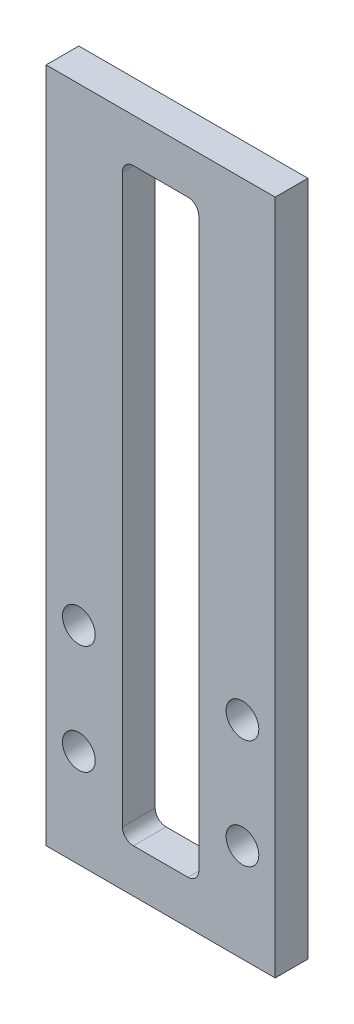
ISO-10303-21;
HEADER;
FILE_DESCRIPTION(('STEP AP214'),'2;1');
FILE_NAME('part.step','',(''),(''),'','','');
FILE_SCHEMA(('AUTOMOTIVE_DESIGN { 1 0 10303 214 1 1 1 1 }'));
ENDSEC;
DATA;
#1=APPLICATION_CONTEXT('core data for automotive mechanical design processes');
#2=APPLICATION_PROTOCOL_DEFINITION('international standard','automotive_design',2000,#1);
#3=PRODUCT_CONTEXT('',#1,'mechanical');
#4=PRODUCT('Part','Part','',(#3));
#5=PRODUCT_RELATED_PRODUCT_CATEGORY('part','',(#4));
#6=PRODUCT_DEFINITION_FORMATION('','',#4);
#7=PRODUCT_DEFINITION_CONTEXT('part definition',#1,'design');
#8=PRODUCT_DEFINITION('design','',#6,#7);
#9=PRODUCT_DEFINITION_SHAPE('','',#8);
#10=(LENGTH_UNIT() NAMED_UNIT(*) SI_UNIT(.MILLI.,.METRE.));
#11=(NAMED_UNIT(*) PLANE_ANGLE_UNIT() SI_UNIT($,.RADIAN.));
#12=(NAMED_UNIT(*) SI_UNIT($,.STERADIAN.) SOLID_ANGLE_UNIT());
#13=UNCERTAINTY_MEASURE_WITH_UNIT(LENGTH_MEASURE(1.E-05),#10,'distance_accuracy_value','');
#14=(GEOMETRIC_REPRESENTATION_CONTEXT(3) GLOBAL_UNCERTAINTY_ASSIGNED_CONTEXT((#13)) GLOBAL_UNIT_ASSIGNED_CONTEXT((#10,
#11,#12)) REPRESENTATION_CONTEXT('',''));
#15=CARTESIAN_POINT('',(0.,0.,0.));
#16=DIRECTION('',(0.,0.,1.));
#17=DIRECTION('',(1.,0.,0.));
#18=AXIS2_PLACEMENT_3D('',#15,#16,#17);
#19=CARTESIAN_POINT('',(0.,0.,3.));
#20=DIRECTION('',(0.,0.,1.));
#21=DIRECTION('',(1.,0.,0.));
#22=AXIS2_PLACEMENT_3D('',#19,#20,#21);
#23=PLANE('',#22);
#24=DIRECTION('',(0.,-1.,0.));
#25=VECTOR('',#24,1.);
#26=CARTESIAN_POINT('',(-3.49999999999999,44.,3.));
#27=LINE('',#26,#25);
#28=CARTESIAN_POINT('',(-3.49999999999999,43.,3.));
#29=VERTEX_POINT('',#28);
#30=CARTESIAN_POINT('',(-3.5,-8.99999999999999,3.));
#31=VERTEX_POINT('',#30);
#32=EDGE_CURVE('E229',#29,#31,#27,.T.);
#33=ORIENTED_EDGE('',*,*,#32,.F.);
#34=CARTESIAN_POINT('',(-2.49999999999999,43.,3.));
#35=DIRECTION('',(0.,0.,1.));
#36=DIRECTION('',(1.,0.,0.));
#37=AXIS2_PLACEMENT_3D('',#34,#35,#36);
#38=CIRCLE('',#37,1.);
#39=CARTESIAN_POINT('',(-2.49999999999999,44.,3.));
#40=VERTEX_POINT('',#39);
#41=EDGE_CURVE('E42',#29,#40,#38,.F.);
#42=ORIENTED_EDGE('',*,*,#41,.T.);
#43=DIRECTION('',(-1.,0.,0.));
#44=VECTOR('',#43,1.);
#45=CARTESIAN_POINT('',(-3.49999999999999,44.,3.));
#46=LINE('',#45,#44);
#47=CARTESIAN_POINT('',(2.49999999999999,44.,3.));
#48=VERTEX_POINT('',#47);
#49=EDGE_CURVE('E227',#48,#40,#46,.T.);
#50=ORIENTED_EDGE('',*,*,#49,.F.);
#51=CARTESIAN_POINT('',(2.49999999999999,43.,3.));
#52=DIRECTION('',(0.,0.,1.));
#53=DIRECTION('',(1.,0.,0.));
#54=AXIS2_PLACEMENT_3D('',#51,#52,#53);
#55=CIRCLE('',#54,1.);
#56=CARTESIAN_POINT('',(3.49999999999999,43.,3.));
#57=VERTEX_POINT('',#56);
#58=EDGE_CURVE('E222',#48,#57,#55,.F.);
#59=ORIENTED_EDGE('',*,*,#58,.T.);
#60=DIRECTION('',(0.,1.,0.));
#61=VECTOR('',#60,1.);
#62=CARTESIAN_POINT('',(3.49999999999999,44.,3.));
#63=LINE('',#62,#61);
#64=CARTESIAN_POINT('',(3.5,-8.99999999999999,3.));
#65=VERTEX_POINT('',#64);
#66=EDGE_CURVE('E235',#65,#57,#63,.T.);
#67=ORIENTED_EDGE('',*,*,#66,.F.);
#68=CARTESIAN_POINT('',(2.5,-8.99999999999999,3.));
#69=DIRECTION('',(0.,0.,1.));
#70=DIRECTION('',(1.,0.,0.));
#71=AXIS2_PLACEMENT_3D('',#68,#69,#70);
#72=CIRCLE('',#71,1.);
#73=CARTESIAN_POINT('',(2.5,-10.,3.));
#74=VERTEX_POINT('',#73);
#75=EDGE_CURVE('E214',#65,#74,#72,.F.);
#76=ORIENTED_EDGE('',*,*,#75,.T.);
#77=DIRECTION('',(1.,0.,0.));
#78=VECTOR('',#77,1.);
#79=CARTESIAN_POINT('',(-3.5,-10.,3.));
#80=LINE('',#79,#78);
#81=CARTESIAN_POINT('',(-2.5,-10.,3.));
#82=VERTEX_POINT('',#81);
#83=EDGE_CURVE('E252',#82,#74,#80,.T.);
#84=ORIENTED_EDGE('',*,*,#83,.F.);
#85=CARTESIAN_POINT('',(-2.5,-9.,3.));
#86=DIRECTION('',(0.,0.,1.));
#87=DIRECTION('',(1.,0.,0.));
#88=AXIS2_PLACEMENT_3D('',#85,#86,#87);
#89=CIRCLE('',#88,1.);
#90=EDGE_CURVE('E218',#82,#31,#89,.F.);
#91=ORIENTED_EDGE('',*,*,#90,.T.);
#92=EDGE_LOOP('',(#33,#42,#50,#59,#67,#76,#84,#91));
#93=FACE_BOUND('',#92,.T.);
#94=DIRECTION('',(0.,1.,0.));
#95=VECTOR('',#94,1.);
#96=CARTESIAN_POINT('',(10.5,-14.,3.));
#97=LINE('',#96,#95);
#98=CARTESIAN_POINT('',(10.5,-14.,3.));
#99=VERTEX_POINT('',#98);
#100=CARTESIAN_POINT('',(10.5,48.,3.));
#101=VERTEX_POINT('',#100);
#102=EDGE_CURVE('E124',#99,#101,#97,.T.);
#103=ORIENTED_EDGE('',*,*,#102,.T.);
#104=DIRECTION('',(-1.,0.,0.));
#105=VECTOR('',#104,1.);
#106=CARTESIAN_POINT('',(-10.5,48.,3.));
#107=LINE('',#106,#105);
#108=CARTESIAN_POINT('',(-10.5,48.,3.));
#109=VERTEX_POINT('',#108);
#110=EDGE_CURVE('E129',#101,#109,#107,.T.);
#111=ORIENTED_EDGE('',*,*,#110,.T.);
#112=DIRECTION('',(0.,-1.,0.));
#113=VECTOR('',#112,1.);
#114=CARTESIAN_POINT('',(-10.5,14.,3.));
#115=LINE('',#114,#113);
#116=CARTESIAN_POINT('',(-10.5,-14.,3.));
#117=VERTEX_POINT('',#116);
#118=EDGE_CURVE('E183',#109,#117,#115,.T.);
#119=ORIENTED_EDGE('',*,*,#118,.T.);
#120=DIRECTION('',(1.,0.,0.));
#121=VECTOR('',#120,1.);
#122=CARTESIAN_POINT('',(-10.5,-14.,3.));
#123=LINE('',#122,#121);
#124=EDGE_CURVE('E130',#117,#99,#123,.T.);
#125=ORIENTED_EDGE('',*,*,#124,.T.);
#126=EDGE_LOOP('',(#103,#111,#119,#125));
#127=FACE_BOUND('',#126,.T.);
#128=CARTESIAN_POINT('',(-7.5,-5.,3.));
#129=DIRECTION('',(0.,0.,1.));
#130=DIRECTION('',(1.,0.,0.));
#131=AXIS2_PLACEMENT_3D('',#128,#129,#130);
#132=CIRCLE('',#131,1.5);
#133=CARTESIAN_POINT('',(-6.,-5.,3.));
#134=VERTEX_POINT('',#133);
#135=EDGE_CURVE('E165',#134,#134,#132,.T.);
#136=ORIENTED_EDGE('',*,*,#135,.F.);
#137=EDGE_LOOP('',(#136));
#138=FACE_BOUND('',#137,.T.);
#139=CARTESIAN_POINT('',(-7.5,5.,3.));
#140=DIRECTION('',(0.,0.,1.));
#141=DIRECTION('',(1.,0.,0.));
#142=AXIS2_PLACEMENT_3D('',#139,#140,#141);
#143=CIRCLE('',#142,1.5);
#144=CARTESIAN_POINT('',(-6.,5.,3.));
#145=VERTEX_POINT('',#144);
#146=EDGE_CURVE('E177',#145,#145,#143,.T.);
#147=ORIENTED_EDGE('',*,*,#146,.F.);
#148=EDGE_LOOP('',(#147));
#149=FACE_BOUND('',#148,.T.);
#150=CARTESIAN_POINT('',(7.5,5.,3.));
#151=DIRECTION('',(0.,0.,1.));
#152=DIRECTION('',(1.,0.,0.));
#153=AXIS2_PLACEMENT_3D('',#150,#151,#152);
#154=CIRCLE('',#153,1.5);
#155=CARTESIAN_POINT('',(9.,5.,3.));
#156=VERTEX_POINT('',#155);
#157=EDGE_CURVE('E171',#156,#156,#154,.T.);
#158=ORIENTED_EDGE('',*,*,#157,.F.);
#159=EDGE_LOOP('',(#158));
#160=FACE_BOUND('',#159,.T.);
#161=CARTESIAN_POINT('',(7.5,-5.,3.));
#162=DIRECTION('',(0.,0.,1.));
#163=DIRECTION('',(1.,0.,0.));
#164=AXIS2_PLACEMENT_3D('',#161,#162,#163);
#165=CIRCLE('',#164,1.5);
#166=CARTESIAN_POINT('',(9.,-5.,3.));
#167=VERTEX_POINT('',#166);
#168=EDGE_CURVE('E158',#167,#167,#165,.T.);
#169=ORIENTED_EDGE('',*,*,#168,.F.);
#170=EDGE_LOOP('',(#169));
#171=FACE_BOUND('',#170,.T.);
#172=ADVANCED_FACE('F34',(#93,#127,#138,#149,#160,#171),#23,.T.);
#173=CARTESIAN_POINT('',(0.,0.,0.));
#174=DIRECTION('',(0.,0.,1.));
#175=DIRECTION('',(1.,0.,0.));
#176=AXIS2_PLACEMENT_3D('',#173,#174,#175);
#177=PLANE('',#176);
#178=DIRECTION('',(0.,1.,0.));
#179=VECTOR('',#178,1.);
#180=CARTESIAN_POINT('',(3.49999999999999,44.,0.));
#181=LINE('',#180,#179);
#182=CARTESIAN_POINT('',(3.5,-8.99999999999999,0.));
#183=VERTEX_POINT('',#182);
#184=CARTESIAN_POINT('',(3.49999999999999,43.,0.));
#185=VERTEX_POINT('',#184);
#186=EDGE_CURVE('E151',#183,#185,#181,.T.);
#187=ORIENTED_EDGE('',*,*,#186,.T.);
#188=CARTESIAN_POINT('',(2.49999999999999,43.,0.));
#189=DIRECTION('',(0.,0.,1.));
#190=DIRECTION('',(1.,0.,0.));
#191=AXIS2_PLACEMENT_3D('',#188,#189,#190);
#192=CIRCLE('',#191,1.);
#193=CARTESIAN_POINT('',(2.49999999999999,44.,0.));
#194=VERTEX_POINT('',#193);
#195=EDGE_CURVE('E56',#185,#194,#192,.T.);
#196=ORIENTED_EDGE('',*,*,#195,.T.);
#197=DIRECTION('',(-1.,0.,0.));
#198=VECTOR('',#197,1.);
#199=CARTESIAN_POINT('',(-3.49999999999999,44.,0.));
#200=LINE('',#199,#198);
#201=CARTESIAN_POINT('',(-2.49999999999999,44.,0.));
#202=VERTEX_POINT('',#201);
#203=EDGE_CURVE('E149',#194,#202,#200,.T.);
#204=ORIENTED_EDGE('',*,*,#203,.T.);
#205=CARTESIAN_POINT('',(-2.49999999999999,43.,0.));
#206=DIRECTION('',(0.,0.,1.));
#207=DIRECTION('',(1.,0.,0.));
#208=AXIS2_PLACEMENT_3D('',#205,#206,#207);
#209=CIRCLE('',#208,1.);
#210=CARTESIAN_POINT('',(-3.49999999999999,43.,0.));
#211=VERTEX_POINT('',#210);
#212=EDGE_CURVE('E11',#202,#211,#209,.T.);
#213=ORIENTED_EDGE('',*,*,#212,.T.);
#214=DIRECTION('',(0.,-1.,0.));
#215=VECTOR('',#214,1.);
#216=CARTESIAN_POINT('',(-3.49999999999999,44.,0.));
#217=LINE('',#216,#215);
#218=CARTESIAN_POINT('',(-3.5,-8.99999999999999,0.));
#219=VERTEX_POINT('',#218);
#220=EDGE_CURVE('E234',#211,#219,#217,.T.);
#221=ORIENTED_EDGE('',*,*,#220,.T.);
#222=CARTESIAN_POINT('',(-2.5,-9.,0.));
#223=DIRECTION('',(0.,0.,1.));
#224=DIRECTION('',(1.,0.,0.));
#225=AXIS2_PLACEMENT_3D('',#222,#223,#224);
#226=CIRCLE('',#225,1.);
#227=CARTESIAN_POINT('',(-2.5,-10.,0.));
#228=VERTEX_POINT('',#227);
#229=EDGE_CURVE('E220',#219,#228,#226,.T.);
#230=ORIENTED_EDGE('',*,*,#229,.T.);
#231=DIRECTION('',(1.,0.,0.));
#232=VECTOR('',#231,1.);
#233=CARTESIAN_POINT('',(-3.5,-10.,0.));
#234=LINE('',#233,#232);
#235=CARTESIAN_POINT('',(2.5,-10.,0.));
#236=VERTEX_POINT('',#235);
#237=EDGE_CURVE('E245',#228,#236,#234,.T.);
#238=ORIENTED_EDGE('',*,*,#237,.T.);
#239=CARTESIAN_POINT('',(2.5,-8.99999999999999,0.));
#240=DIRECTION('',(0.,0.,1.));
#241=DIRECTION('',(1.,0.,0.));
#242=AXIS2_PLACEMENT_3D('',#239,#240,#241);
#243=CIRCLE('',#242,1.);
#244=EDGE_CURVE('E216',#236,#183,#243,.T.);
#245=ORIENTED_EDGE('',*,*,#244,.T.);
#246=EDGE_LOOP('',(#187,#196,#204,#213,#221,#230,#238,#245));
#247=FACE_BOUND('',#246,.T.);
#248=DIRECTION('',(0.,-1.,0.));
#249=VECTOR('',#248,1.);
#250=CARTESIAN_POINT('',(-10.5,14.,0.));
#251=LINE('',#250,#249);
#252=CARTESIAN_POINT('',(-10.5,48.,0.));
#253=VERTEX_POINT('',#252);
#254=CARTESIAN_POINT('',(-10.5,-14.,0.));
#255=VERTEX_POINT('',#254);
#256=EDGE_CURVE('E180',#253,#255,#251,.T.);
#257=ORIENTED_EDGE('',*,*,#256,.F.);
#258=DIRECTION('',(1.,0.,0.));
#259=VECTOR('',#258,1.);
#260=CARTESIAN_POINT('',(-10.5,48.,0.));
#261=LINE('',#260,#259);
#262=CARTESIAN_POINT('',(10.5,48.,0.));
#263=VERTEX_POINT('',#262);
#264=EDGE_CURVE('E155',#253,#263,#261,.T.);
#265=ORIENTED_EDGE('',*,*,#264,.T.);
#266=DIRECTION('',(0.,1.,0.));
#267=VECTOR('',#266,1.);
#268=CARTESIAN_POINT('',(10.5,-14.,0.));
#269=LINE('',#268,#267);
#270=CARTESIAN_POINT('',(10.5,-14.,0.));
#271=VERTEX_POINT('',#270);
#272=EDGE_CURVE('E140',#271,#263,#269,.T.);
#273=ORIENTED_EDGE('',*,*,#272,.F.);
#274=DIRECTION('',(1.,0.,0.));
#275=VECTOR('',#274,1.);
#276=CARTESIAN_POINT('',(-10.5,-14.,0.));
#277=LINE('',#276,#275);
#278=EDGE_CURVE('E188',#255,#271,#277,.T.);
#279=ORIENTED_EDGE('',*,*,#278,.F.);
#280=EDGE_LOOP('',(#257,#265,#273,#279));
#281=FACE_BOUND('',#280,.T.);
#282=CARTESIAN_POINT('',(-7.5,5.,0.));
#283=DIRECTION('',(0.,0.,1.));
#284=DIRECTION('',(1.,0.,0.));
#285=AXIS2_PLACEMENT_3D('',#282,#283,#284);
#286=CIRCLE('',#285,1.5);
#287=CARTESIAN_POINT('',(-6.,5.,0.));
#288=VERTEX_POINT('',#287);
#289=EDGE_CURVE('E174',#288,#288,#286,.T.);
#290=ORIENTED_EDGE('',*,*,#289,.T.);
#291=EDGE_LOOP('',(#290));
#292=FACE_BOUND('',#291,.T.);
#293=CARTESIAN_POINT('',(7.5,5.,0.));
#294=DIRECTION('',(0.,0.,1.));
#295=DIRECTION('',(1.,0.,0.));
#296=AXIS2_PLACEMENT_3D('',#293,#294,#295);
#297=CIRCLE('',#296,1.5);
#298=CARTESIAN_POINT('',(9.,5.,0.));
#299=VERTEX_POINT('',#298);
#300=EDGE_CURVE('E168',#299,#299,#297,.T.);
#301=ORIENTED_EDGE('',*,*,#300,.T.);
#302=EDGE_LOOP('',(#301));
#303=FACE_BOUND('',#302,.T.);
#304=CARTESIAN_POINT('',(-7.5,-5.,0.));
#305=DIRECTION('',(0.,0.,1.));
#306=DIRECTION('',(1.,0.,0.));
#307=AXIS2_PLACEMENT_3D('',#304,#305,#306);
#308=CIRCLE('',#307,1.5);
#309=CARTESIAN_POINT('',(-6.,-5.,0.));
#310=VERTEX_POINT('',#309);
#311=EDGE_CURVE('E161',#310,#310,#308,.T.);
#312=ORIENTED_EDGE('',*,*,#311,.T.);
#313=EDGE_LOOP('',(#312));
#314=FACE_BOUND('',#313,.T.);
#315=CARTESIAN_POINT('',(7.5,-5.,0.));
#316=DIRECTION('',(0.,0.,1.));
#317=DIRECTION('',(1.,0.,0.));
#318=AXIS2_PLACEMENT_3D('',#315,#316,#317);
#319=CIRCLE('',#318,1.5);
#320=CARTESIAN_POINT('',(9.,-5.,0.));
#321=VERTEX_POINT('',#320);
#322=EDGE_CURVE('E162',#321,#321,#319,.T.);
#323=ORIENTED_EDGE('',*,*,#322,.T.);
#324=EDGE_LOOP('',(#323));
#325=FACE_BOUND('',#324,.T.);
#326=ADVANCED_FACE('F239',(#247,#281,#292,#303,#314,#325),#177,.F.);
#327=CARTESIAN_POINT('',(-10.5,14.,3.));
#328=DIRECTION('',(1.,0.,0.));
#329=DIRECTION('',(0.,0.,-1.));
#330=AXIS2_PLACEMENT_3D('',#327,#328,#329);
#331=PLANE('',#330);
#332=ORIENTED_EDGE('',*,*,#256,.T.);
#333=DIRECTION('',(0.,0.,-1.));
#334=VECTOR('',#333,1.);
#335=CARTESIAN_POINT('',(-10.5,-14.,3.));
#336=LINE('',#335,#334);
#337=EDGE_CURVE('E192',#117,#255,#336,.T.);
#338=ORIENTED_EDGE('',*,*,#337,.F.);
#339=ORIENTED_EDGE('',*,*,#118,.F.);
#340=DIRECTION('',(0.,0.,1.));
#341=VECTOR('',#340,1.);
#342=CARTESIAN_POINT('',(-10.5,48.,-39.9624824053762));
#343=LINE('',#342,#341);
#344=EDGE_CURVE('E144',#253,#109,#343,.T.);
#345=ORIENTED_EDGE('',*,*,#344,.F.);
#346=EDGE_LOOP('',(#332,#338,#339,#345));
#347=FACE_BOUND('',#346,.T.);
#348=ADVANCED_FACE('F278',(#347),#331,.F.);
#349=CARTESIAN_POINT('',(-10.5,-14.,3.));
#350=DIRECTION('',(0.,1.,0.));
#351=DIRECTION('',(0.,0.,1.));
#352=AXIS2_PLACEMENT_3D('',#349,#350,#351);
#353=PLANE('',#352);
#354=ORIENTED_EDGE('',*,*,#278,.T.);
#355=DIRECTION('',(0.,0.,-1.));
#356=VECTOR('',#355,1.);
#357=CARTESIAN_POINT('',(10.5,-14.,3.));
#358=LINE('',#357,#356);
#359=EDGE_CURVE('E134',#99,#271,#358,.T.);
#360=ORIENTED_EDGE('',*,*,#359,.F.);
#361=ORIENTED_EDGE('',*,*,#124,.F.);
#362=ORIENTED_EDGE('',*,*,#337,.T.);
#363=EDGE_LOOP('',(#354,#360,#361,#362));
#364=FACE_BOUND('',#363,.T.);
#365=ADVANCED_FACE('F286',(#364),#353,.F.);
#366=CARTESIAN_POINT('',(10.5,14.,3.));
#367=DIRECTION('',(-1.,0.,0.));
#368=DIRECTION('',(0.,0.,1.));
#369=AXIS2_PLACEMENT_3D('',#366,#367,#368);
#370=PLANE('',#369);
#371=ORIENTED_EDGE('',*,*,#272,.T.);
#372=DIRECTION('',(0.,0.,1.));
#373=VECTOR('',#372,1.);
#374=CARTESIAN_POINT('',(10.5,48.,-39.9624824053762));
#375=LINE('',#374,#373);
#376=EDGE_CURVE('E137',#263,#101,#375,.T.);
#377=ORIENTED_EDGE('',*,*,#376,.T.);
#378=ORIENTED_EDGE('',*,*,#102,.F.);
#379=ORIENTED_EDGE('',*,*,#359,.T.);
#380=EDGE_LOOP('',(#371,#377,#378,#379));
#381=FACE_BOUND('',#380,.T.);
#382=ADVANCED_FACE('F138',(#381),#370,.F.);
#383=CARTESIAN_POINT('',(-7.5,5.,3.));
#384=DIRECTION('',(0.,0.,-1.));
#385=DIRECTION('',(-1.,0.,0.));
#386=AXIS2_PLACEMENT_3D('',#383,#384,#385);
#387=CYLINDRICAL_SURFACE('',#386,1.5);
#388=ORIENTED_EDGE('',*,*,#146,.T.);
#389=EDGE_LOOP('',(#388));
#390=FACE_BOUND('',#389,.T.);
#391=ORIENTED_EDGE('',*,*,#289,.F.);
#392=EDGE_LOOP('',(#391));
#393=FACE_BOUND('',#392,.T.);
#394=ADVANCED_FACE('F281',(#390,#393),#387,.F.);
#395=CARTESIAN_POINT('',(7.5,5.,3.));
#396=DIRECTION('',(0.,0.,-1.));
#397=DIRECTION('',(-1.,0.,0.));
#398=AXIS2_PLACEMENT_3D('',#395,#396,#397);
#399=CYLINDRICAL_SURFACE('',#398,1.5);
#400=ORIENTED_EDGE('',*,*,#157,.T.);
#401=EDGE_LOOP('',(#400));
#402=FACE_BOUND('',#401,.T.);
#403=ORIENTED_EDGE('',*,*,#300,.F.);
#404=EDGE_LOOP('',(#403));
#405=FACE_BOUND('',#404,.T.);
#406=ADVANCED_FACE('F322',(#402,#405),#399,.F.);
#407=CARTESIAN_POINT('',(-7.5,-5.,3.));
#408=DIRECTION('',(0.,0.,-1.));
#409=DIRECTION('',(-1.,0.,0.));
#410=AXIS2_PLACEMENT_3D('',#407,#408,#409);
#411=CYLINDRICAL_SURFACE('',#410,1.5);
#412=ORIENTED_EDGE('',*,*,#135,.T.);
#413=EDGE_LOOP('',(#412));
#414=FACE_BOUND('',#413,.T.);
#415=ORIENTED_EDGE('',*,*,#311,.F.);
#416=EDGE_LOOP('',(#415));
#417=FACE_BOUND('',#416,.T.);
#418=ADVANCED_FACE('F319',(#414,#417),#411,.F.);
#419=CARTESIAN_POINT('',(7.5,-5.,3.));
#420=DIRECTION('',(0.,0.,-1.));
#421=DIRECTION('',(-1.,0.,0.));
#422=AXIS2_PLACEMENT_3D('',#419,#420,#421);
#423=CYLINDRICAL_SURFACE('',#422,1.5);
#424=ORIENTED_EDGE('',*,*,#168,.T.);
#425=EDGE_LOOP('',(#424));
#426=FACE_BOUND('',#425,.T.);
#427=ORIENTED_EDGE('',*,*,#322,.F.);
#428=EDGE_LOOP('',(#427));
#429=FACE_BOUND('',#428,.T.);
#430=ADVANCED_FACE('F316',(#426,#429),#423,.F.);
#431=CARTESIAN_POINT('',(-10.5,48.,-39.9624824053762));
#432=DIRECTION('',(0.,1.,0.));
#433=DIRECTION('',(0.,0.,1.));
#434=AXIS2_PLACEMENT_3D('',#431,#432,#433);
#435=PLANE('',#434);
#436=ORIENTED_EDGE('',*,*,#264,.F.);
#437=ORIENTED_EDGE('',*,*,#344,.T.);
#438=ORIENTED_EDGE('',*,*,#110,.F.);
#439=ORIENTED_EDGE('',*,*,#376,.F.);
#440=EDGE_LOOP('',(#436,#437,#438,#439));
#441=FACE_BOUND('',#440,.T.);
#442=ADVANCED_FACE('F147',(#441),#435,.T.);
#443=CARTESIAN_POINT('',(-3.49999999999999,44.,0.));
#444=DIRECTION('',(-1.,0.,0.));
#445=DIRECTION('',(0.,-1.,0.));
#446=AXIS2_PLACEMENT_3D('',#443,#444,#445);
#447=PLANE('',#446);
#448=ORIENTED_EDGE('',*,*,#32,.T.);
#449=DIRECTION('',(0.,0.,1.));
#450=VECTOR('',#449,1.);
#451=CARTESIAN_POINT('',(-3.5,-9.,0.));
#452=LINE('',#451,#450);
#453=EDGE_CURVE('E208',#31,#219,#452,.F.);
#454=ORIENTED_EDGE('',*,*,#453,.T.);
#455=ORIENTED_EDGE('',*,*,#220,.F.);
#456=DIRECTION('',(0.,0.,1.));
#457=VECTOR('',#456,1.);
#458=CARTESIAN_POINT('',(-3.49999999999999,43.,3.));
#459=LINE('',#458,#457);
#460=EDGE_CURVE('E205',#211,#29,#459,.T.);
#461=ORIENTED_EDGE('',*,*,#460,.T.);
#462=EDGE_LOOP('',(#448,#454,#455,#461));
#463=FACE_BOUND('',#462,.T.);
#464=ADVANCED_FACE('F243',(#463),#447,.F.);
#465=CARTESIAN_POINT('',(-3.49999999999999,44.,0.));
#466=DIRECTION('',(0.,1.,0.));
#467=DIRECTION('',(0.,0.,1.));
#468=AXIS2_PLACEMENT_3D('',#465,#466,#467);
#469=PLANE('',#468);
#470=ORIENTED_EDGE('',*,*,#203,.F.);
#471=DIRECTION('',(0.,0.,1.));
#472=VECTOR('',#471,1.);
#473=CARTESIAN_POINT('',(2.49999999999999,44.,3.));
#474=LINE('',#473,#472);
#475=EDGE_CURVE('E211',#194,#48,#474,.T.);
#476=ORIENTED_EDGE('',*,*,#475,.T.);
#477=ORIENTED_EDGE('',*,*,#49,.T.);
#478=DIRECTION('',(0.,0.,1.));
#479=VECTOR('',#478,1.);
#480=CARTESIAN_POINT('',(-2.49999999999999,44.,0.));
#481=LINE('',#480,#479);
#482=EDGE_CURVE('E49',#40,#202,#481,.F.);
#483=ORIENTED_EDGE('',*,*,#482,.T.);
#484=EDGE_LOOP('',(#470,#476,#477,#483));
#485=FACE_BOUND('',#484,.T.);
#486=ADVANCED_FACE('F232',(#485),#469,.F.);
#487=CARTESIAN_POINT('',(3.49999999999999,44.,0.));
#488=DIRECTION('',(1.,0.,0.));
#489=DIRECTION('',(0.,1.,0.));
#490=AXIS2_PLACEMENT_3D('',#487,#488,#489);
#491=PLANE('',#490);
#492=ORIENTED_EDGE('',*,*,#186,.F.);
#493=DIRECTION('',(0.,0.,1.));
#494=VECTOR('',#493,1.);
#495=CARTESIAN_POINT('',(3.5,-8.99999999999999,3.));
#496=LINE('',#495,#494);
#497=EDGE_CURVE('E197',#183,#65,#496,.T.);
#498=ORIENTED_EDGE('',*,*,#497,.T.);
#499=ORIENTED_EDGE('',*,*,#66,.T.);
#500=DIRECTION('',(0.,0.,1.));
#501=VECTOR('',#500,1.);
#502=CARTESIAN_POINT('',(3.49999999999999,43.,0.));
#503=LINE('',#502,#501);
#504=EDGE_CURVE('E195',#57,#185,#503,.F.);
#505=ORIENTED_EDGE('',*,*,#504,.T.);
#506=EDGE_LOOP('',(#492,#498,#499,#505));
#507=FACE_BOUND('',#506,.T.);
#508=ADVANCED_FACE('F260',(#507),#491,.F.);
#509=CARTESIAN_POINT('',(-3.5,-10.,0.));
#510=DIRECTION('',(0.,-1.,0.));
#511=DIRECTION('',(0.,0.,-1.));
#512=AXIS2_PLACEMENT_3D('',#509,#510,#511);
#513=PLANE('',#512);
#514=ORIENTED_EDGE('',*,*,#83,.T.);
#515=DIRECTION('',(0.,0.,1.));
#516=VECTOR('',#515,1.);
#517=CARTESIAN_POINT('',(2.5,-10.,0.));
#518=LINE('',#517,#516);
#519=EDGE_CURVE('E203',#74,#236,#518,.F.);
#520=ORIENTED_EDGE('',*,*,#519,.T.);
#521=ORIENTED_EDGE('',*,*,#237,.F.);
#522=DIRECTION('',(0.,0.,1.));
#523=VECTOR('',#522,1.);
#524=CARTESIAN_POINT('',(-2.5,-10.,3.));
#525=LINE('',#524,#523);
#526=EDGE_CURVE('E200',#228,#82,#525,.T.);
#527=ORIENTED_EDGE('',*,*,#526,.T.);
#528=EDGE_LOOP('',(#514,#520,#521,#527));
#529=FACE_BOUND('',#528,.T.);
#530=ADVANCED_FACE('F294',(#529),#513,.F.);
#531=CARTESIAN_POINT('',(2.5,-8.99999999999999,0.));
#532=DIRECTION('',(0.,0.,-1.));
#533=DIRECTION('',(-1.,0.,0.));
#534=AXIS2_PLACEMENT_3D('',#531,#532,#533);
#535=CYLINDRICAL_SURFACE('',#534,1.);
#536=ORIENTED_EDGE('',*,*,#244,.F.);
#537=ORIENTED_EDGE('',*,*,#519,.F.);
#538=ORIENTED_EDGE('',*,*,#75,.F.);
#539=ORIENTED_EDGE('',*,*,#497,.F.);
#540=EDGE_LOOP('',(#536,#537,#538,#539));
#541=FACE_BOUND('',#540,.T.);
#542=ADVANCED_FACE('F270',(#541),#535,.F.);
#543=CARTESIAN_POINT('',(-2.5,-9.,0.));
#544=DIRECTION('',(0.,0.,-1.));
#545=DIRECTION('',(-1.,0.,0.));
#546=AXIS2_PLACEMENT_3D('',#543,#544,#545);
#547=CYLINDRICAL_SURFACE('',#546,1.);
#548=ORIENTED_EDGE('',*,*,#229,.F.);
#549=ORIENTED_EDGE('',*,*,#453,.F.);
#550=ORIENTED_EDGE('',*,*,#90,.F.);
#551=ORIENTED_EDGE('',*,*,#526,.F.);
#552=EDGE_LOOP('',(#548,#549,#550,#551));
#553=FACE_BOUND('',#552,.T.);
#554=ADVANCED_FACE('F265',(#553),#547,.F.);
#555=CARTESIAN_POINT('',(2.49999999999999,43.,0.));
#556=DIRECTION('',(0.,0.,-1.));
#557=DIRECTION('',(-1.,0.,0.));
#558=AXIS2_PLACEMENT_3D('',#555,#556,#557);
#559=CYLINDRICAL_SURFACE('',#558,1.);
#560=ORIENTED_EDGE('',*,*,#195,.F.);
#561=ORIENTED_EDGE('',*,*,#504,.F.);
#562=ORIENTED_EDGE('',*,*,#58,.F.);
#563=ORIENTED_EDGE('',*,*,#475,.F.);
#564=EDGE_LOOP('',(#560,#561,#562,#563));
#565=FACE_BOUND('',#564,.T.);
#566=ADVANCED_FACE('F263',(#565),#559,.F.);
#567=CARTESIAN_POINT('',(-2.49999999999999,43.,0.));
#568=DIRECTION('',(0.,0.,-1.));
#569=DIRECTION('',(-1.,0.,0.));
#570=AXIS2_PLACEMENT_3D('',#567,#568,#569);
#571=CYLINDRICAL_SURFACE('',#570,1.);
#572=ORIENTED_EDGE('',*,*,#212,.F.);
#573=ORIENTED_EDGE('',*,*,#482,.F.);
#574=ORIENTED_EDGE('',*,*,#41,.F.);
#575=ORIENTED_EDGE('',*,*,#460,.F.);
#576=EDGE_LOOP('',(#572,#573,#574,#575));
#577=FACE_BOUND('',#576,.T.);
#578=ADVANCED_FACE('F36',(#577),#571,.F.);
#579=CLOSED_SHELL('',(#172,#326,#348,#365,#382,#394,#406,#418,#430,#442,#464,#486,#508,#530,
#542,#554,#566,#578));
#580=MANIFOLD_SOLID_BREP('B2',#579);
#581=ADVANCED_BREP_SHAPE_REPRESENTATION('',(#18,#580),#14);
#582=SHAPE_DEFINITION_REPRESENTATION(#9,#581);
ENDSEC;
END-ISO-10303-21;
